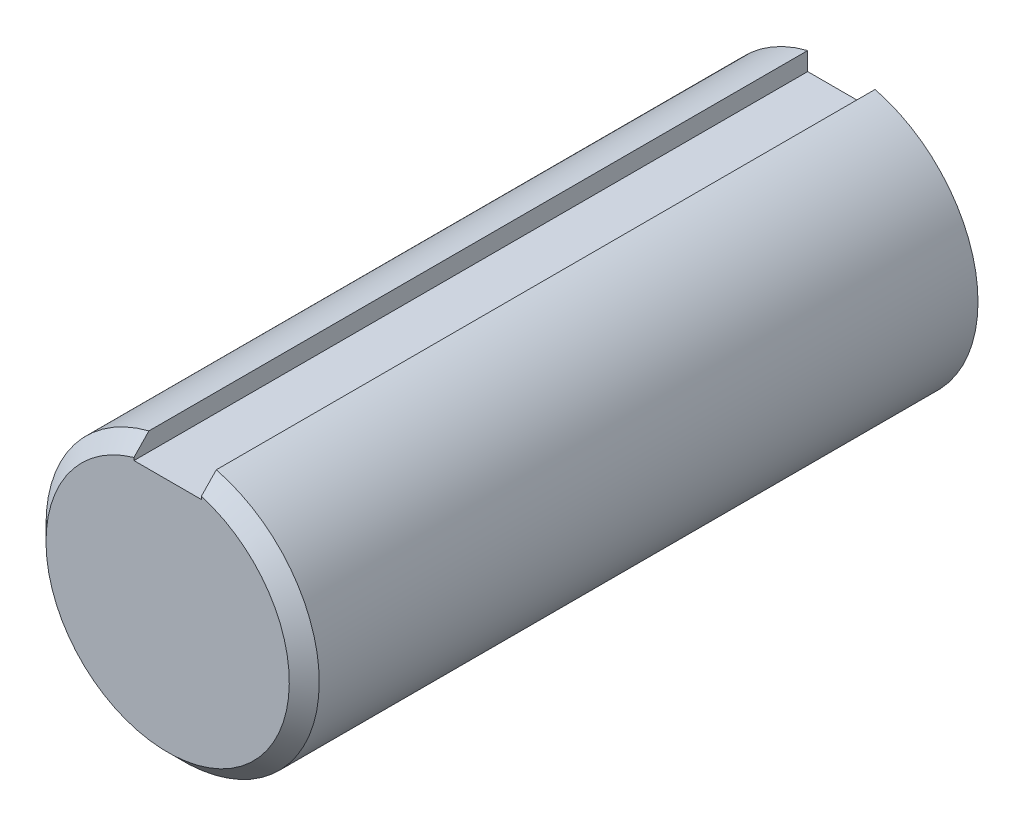
ISO-10303-21;
HEADER;
FILE_DESCRIPTION(('STEP AP214'),'2;1');
FILE_NAME('part.step','',(''),(''),'','','');
FILE_SCHEMA(('AUTOMOTIVE_DESIGN { 1 0 10303 214 1 1 1 1 }'));
ENDSEC;
DATA;
#1=APPLICATION_CONTEXT('core data for automotive mechanical design processes');
#2=APPLICATION_PROTOCOL_DEFINITION('international standard','automotive_design',2000,#1);
#3=PRODUCT_CONTEXT('',#1,'mechanical');
#4=PRODUCT('Part','Part','',(#3));
#5=PRODUCT_RELATED_PRODUCT_CATEGORY('part','',(#4));
#6=PRODUCT_DEFINITION_FORMATION('','',#4);
#7=PRODUCT_DEFINITION_CONTEXT('part definition',#1,'design');
#8=PRODUCT_DEFINITION('design','',#6,#7);
#9=PRODUCT_DEFINITION_SHAPE('','',#8);
#10=(LENGTH_UNIT() NAMED_UNIT(*) SI_UNIT(.MILLI.,.METRE.));
#11=(NAMED_UNIT(*) PLANE_ANGLE_UNIT() SI_UNIT($,.RADIAN.));
#12=(NAMED_UNIT(*) SI_UNIT($,.STERADIAN.) SOLID_ANGLE_UNIT());
#13=UNCERTAINTY_MEASURE_WITH_UNIT(LENGTH_MEASURE(1.E-05),#10,'distance_accuracy_value','');
#14=(GEOMETRIC_REPRESENTATION_CONTEXT(3) GLOBAL_UNCERTAINTY_ASSIGNED_CONTEXT((#13)) GLOBAL_UNIT_ASSIGNED_CONTEXT((#10,
#11,#12)) REPRESENTATION_CONTEXT('',''));
#15=CARTESIAN_POINT('',(0.,0.,0.));
#16=DIRECTION('',(0.,0.,1.));
#17=DIRECTION('',(1.,0.,0.));
#18=AXIS2_PLACEMENT_3D('',#15,#16,#17);
#19=CARTESIAN_POINT('',(0.,0.,90.));
#20=DIRECTION('',(0.,0.,-1.));
#21=DIRECTION('',(-1.,0.,0.));
#22=AXIS2_PLACEMENT_3D('',#19,#20,#21);
#23=CYLINDRICAL_SURFACE('',#22,18.25);
#24=DIRECTION('',(0.,0.,-1.));
#25=VECTOR('',#24,1.);
#26=CARTESIAN_POINT('',(4.5,17.686506155824,90.));
#27=LINE('',#26,#25);
#28=CARTESIAN_POINT('',(4.5,17.686506155824,0.));
#29=VERTEX_POINT('',#28);
#30=CARTESIAN_POINT('',(4.5,17.686506155824,88.));
#31=VERTEX_POINT('',#30);
#32=EDGE_CURVE('E158',#29,#31,#27,.F.);
#33=ORIENTED_EDGE('',*,*,#32,.T.);
#34=CARTESIAN_POINT('',(0.,0.,88.));
#35=DIRECTION('',(0.,0.,1.));
#36=DIRECTION('',(1.,0.,0.));
#37=AXIS2_PLACEMENT_3D('',#34,#35,#36);
#38=CIRCLE('',#37,18.25);
#39=CARTESIAN_POINT('',(-4.5,17.686506155824,88.));
#40=VERTEX_POINT('',#39);
#41=EDGE_CURVE('E61',#31,#40,#38,.F.);
#42=ORIENTED_EDGE('',*,*,#41,.T.);
#43=DIRECTION('',(0.,0.,-1.));
#44=VECTOR('',#43,1.);
#45=CARTESIAN_POINT('',(-4.5,17.686506155824,90.));
#46=LINE('',#45,#44);
#47=CARTESIAN_POINT('',(-4.5,17.686506155824,0.));
#48=VERTEX_POINT('',#47);
#49=EDGE_CURVE('E132',#40,#48,#46,.T.);
#50=ORIENTED_EDGE('',*,*,#49,.T.);
#51=CARTESIAN_POINT('',(0.,0.,0.));
#52=DIRECTION('',(0.,0.,1.));
#53=DIRECTION('',(1.,0.,0.));
#54=AXIS2_PLACEMENT_3D('',#51,#52,#53);
#55=CIRCLE('',#54,18.25);
#56=EDGE_CURVE('E124',#48,#29,#55,.T.);
#57=ORIENTED_EDGE('',*,*,#56,.T.);
#58=EDGE_LOOP('',(#33,#42,#50,#57));
#59=FACE_BOUND('',#58,.T.);
#60=ADVANCED_FACE('F45',(#59),#23,.T.);
#61=CARTESIAN_POINT('',(0.,0.,90.));
#62=DIRECTION('',(0.,0.,1.));
#63=DIRECTION('',(1.,0.,0.));
#64=AXIS2_PLACEMENT_3D('',#61,#62,#63);
#65=PLANE('',#64);
#66=DIRECTION('',(0.,-1.,0.));
#67=VECTOR('',#66,1.);
#68=CARTESIAN_POINT('',(-4.5,21.25,90.));
#69=LINE('',#68,#67);
#70=CARTESIAN_POINT('',(-4.5,15.6144964696272,90.));
#71=VERTEX_POINT('',#70);
#72=CARTESIAN_POINT('',(-4.5,15.25,90.));
#73=VERTEX_POINT('',#72);
#74=EDGE_CURVE('E105',#71,#73,#69,.T.);
#75=ORIENTED_EDGE('',*,*,#74,.F.);
#76=CARTESIAN_POINT('',(0.,0.,90.));
#77=DIRECTION('',(0.,0.,1.));
#78=DIRECTION('',(1.,0.,0.));
#79=AXIS2_PLACEMENT_3D('',#76,#77,#78);
#80=CIRCLE('',#79,16.25);
#81=CARTESIAN_POINT('',(4.5,15.6144964696272,90.));
#82=VERTEX_POINT('',#81);
#83=EDGE_CURVE('E126',#71,#82,#80,.T.);
#84=ORIENTED_EDGE('',*,*,#83,.T.);
#85=DIRECTION('',(0.,1.,0.));
#86=VECTOR('',#85,1.);
#87=CARTESIAN_POINT('',(4.5,21.25,90.));
#88=LINE('',#87,#86);
#89=CARTESIAN_POINT('',(4.5,15.25,90.));
#90=VERTEX_POINT('',#89);
#91=EDGE_CURVE('E120',#90,#82,#88,.T.);
#92=ORIENTED_EDGE('',*,*,#91,.F.);
#93=DIRECTION('',(1.,0.,0.));
#94=VECTOR('',#93,1.);
#95=CARTESIAN_POINT('',(-4.5,15.25,90.));
#96=LINE('',#95,#94);
#97=EDGE_CURVE('E166',#73,#90,#96,.T.);
#98=ORIENTED_EDGE('',*,*,#97,.F.);
#99=EDGE_LOOP('',(#75,#84,#92,#98));
#100=FACE_BOUND('',#99,.T.);
#101=ADVANCED_FACE('F150',(#100),#65,.T.);
#102=CARTESIAN_POINT('',(0.,0.,0.));
#103=DIRECTION('',(0.,0.,1.));
#104=DIRECTION('',(1.,0.,0.));
#105=AXIS2_PLACEMENT_3D('',#102,#103,#104);
#106=PLANE('',#105);
#107=ORIENTED_EDGE('',*,*,#56,.F.);
#108=DIRECTION('',(0.,-1.,0.));
#109=VECTOR('',#108,1.);
#110=CARTESIAN_POINT('',(-4.5,0.,0.));
#111=LINE('',#110,#109);
#112=CARTESIAN_POINT('',(-4.5,15.25,0.));
#113=VERTEX_POINT('',#112);
#114=EDGE_CURVE('E102',#48,#113,#111,.T.);
#115=ORIENTED_EDGE('',*,*,#114,.T.);
#116=DIRECTION('',(1.,0.,0.));
#117=VECTOR('',#116,1.);
#118=CARTESIAN_POINT('',(-4.5,15.25,0.));
#119=LINE('',#118,#117);
#120=CARTESIAN_POINT('',(4.5,15.25,0.));
#121=VERTEX_POINT('',#120);
#122=EDGE_CURVE('E115',#113,#121,#119,.T.);
#123=ORIENTED_EDGE('',*,*,#122,.T.);
#124=DIRECTION('',(0.,1.,0.));
#125=VECTOR('',#124,1.);
#126=CARTESIAN_POINT('',(4.5,21.25,0.));
#127=LINE('',#126,#125);
#128=EDGE_CURVE('E111',#121,#29,#127,.T.);
#129=ORIENTED_EDGE('',*,*,#128,.T.);
#130=EDGE_LOOP('',(#107,#115,#123,#129));
#131=FACE_BOUND('',#130,.T.);
#132=ADVANCED_FACE('F122',(#131),#106,.F.);
#133=CARTESIAN_POINT('',(-4.5,21.25,0.));
#134=DIRECTION('',(-1.,0.,0.));
#135=DIRECTION('',(0.,-1.,0.));
#136=AXIS2_PLACEMENT_3D('',#133,#134,#135);
#137=PLANE('',#136);
#138=ORIENTED_EDGE('',*,*,#49,.F.);
#139=CARTESIAN_POINT('',(-4.5,17.686506155824,88.));
#140=CARTESIAN_POINT('',(-4.5,17.5141724349954,88.1670121494405));
#141=CARTESIAN_POINT('',(-4.5,17.3417650584135,88.3339483247503));
#142=CARTESIAN_POINT('',(-4.5,16.9967888327292,88.6676533545538));
#143=CARTESIAN_POINT('',(-4.5,16.8242199838093,88.834422209236));
#144=CARTESIAN_POINT('',(-4.5,16.4789062321806,89.1677776325199));
#145=CARTESIAN_POINT('',(-4.5,16.3061613294401,89.3343642010884));
#146=CARTESIAN_POINT('',(-4.5,15.9604781603139,89.6673369770075));
#147=CARTESIAN_POINT('',(-4.5,15.7875398937101,89.8337231841316));
#148=CARTESIAN_POINT('',(-4.5,15.6144964696272,90.));
#149=B_SPLINE_CURVE_WITH_KNOTS('',3,(#139,#140,#141,#142,#143,#144,#145,#146,#147,#148),
.UNSPECIFIED.,.F.,.F.,(4,2,2,2,4),(0.,0.719949812092074,1.43989881164123,2.15984794180479,
2.87979788483486),.UNSPECIFIED.);
#150=EDGE_CURVE('E11',#40,#71,#149,.T.);
#151=ORIENTED_EDGE('',*,*,#150,.T.);
#152=ORIENTED_EDGE('',*,*,#74,.T.);
#153=DIRECTION('',(0.,0.,1.));
#154=VECTOR('',#153,1.);
#155=CARTESIAN_POINT('',(-4.5,15.25,0.));
#156=LINE('',#155,#154);
#157=EDGE_CURVE('E98',#113,#73,#156,.T.);
#158=ORIENTED_EDGE('',*,*,#157,.F.);
#159=ORIENTED_EDGE('',*,*,#114,.F.);
#160=EDGE_LOOP('',(#138,#151,#152,#158,#159));
#161=FACE_BOUND('',#160,.T.);
#162=ADVANCED_FACE('F100',(#161),#137,.F.);
#163=CARTESIAN_POINT('',(4.5,21.25,0.));
#164=DIRECTION('',(1.,0.,0.));
#165=DIRECTION('',(0.,1.,0.));
#166=AXIS2_PLACEMENT_3D('',#163,#164,#165);
#167=PLANE('',#166);
#168=ORIENTED_EDGE('',*,*,#91,.T.);
#169=CARTESIAN_POINT('',(4.5,15.6144964696272,90.));
#170=CARTESIAN_POINT('',(4.5,15.7875398937101,89.8337231841316));
#171=CARTESIAN_POINT('',(4.5,15.9604781603139,89.6673369770075));
#172=CARTESIAN_POINT('',(4.5,16.3061613294401,89.3343642010884));
#173=CARTESIAN_POINT('',(4.5,16.4789062321806,89.1677776325198));
#174=CARTESIAN_POINT('',(4.5,16.8242199838093,88.834422209236));
#175=CARTESIAN_POINT('',(4.5,16.9967888327292,88.6676533545538));
#176=CARTESIAN_POINT('',(4.5,17.3417650584135,88.3339483247503));
#177=CARTESIAN_POINT('',(4.5,17.5141724349954,88.1670121494405));
#178=CARTESIAN_POINT('',(4.5,17.686506155824,88.));
#179=B_SPLINE_CURVE_WITH_KNOTS('',3,(#169,#170,#171,#172,#173,#174,#175,#176,#177,#178),
.UNSPECIFIED.,.F.,.F.,(4,2,2,2,4),(0.,0.719949943030087,1.43989907319363,2.15984807274279,
2.87979788483486),.UNSPECIFIED.);
#180=EDGE_CURVE('E75',#82,#31,#179,.T.);
#181=ORIENTED_EDGE('',*,*,#180,.T.);
#182=ORIENTED_EDGE('',*,*,#32,.F.);
#183=ORIENTED_EDGE('',*,*,#128,.F.);
#184=DIRECTION('',(0.,0.,1.));
#185=VECTOR('',#184,1.);
#186=CARTESIAN_POINT('',(4.5,15.25,0.));
#187=LINE('',#186,#185);
#188=EDGE_CURVE('E110',#121,#90,#187,.T.);
#189=ORIENTED_EDGE('',*,*,#188,.T.);
#190=EDGE_LOOP('',(#168,#181,#182,#183,#189));
#191=FACE_BOUND('',#190,.T.);
#192=ADVANCED_FACE('F142',(#191),#167,.F.);
#193=CARTESIAN_POINT('',(-4.5,15.25,0.));
#194=DIRECTION('',(0.,-1.,0.));
#195=DIRECTION('',(0.,0.,-1.));
#196=AXIS2_PLACEMENT_3D('',#193,#194,#195);
#197=PLANE('',#196);
#198=ORIENTED_EDGE('',*,*,#97,.T.);
#199=ORIENTED_EDGE('',*,*,#188,.F.);
#200=ORIENTED_EDGE('',*,*,#122,.F.);
#201=ORIENTED_EDGE('',*,*,#157,.T.);
#202=EDGE_LOOP('',(#198,#199,#200,#201));
#203=FACE_BOUND('',#202,.T.);
#204=ADVANCED_FACE('F116',(#203),#197,.F.);
#205=CARTESIAN_POINT('',(0.,0.,90.));
#206=DIRECTION('',(0.,0.,-1.));
#207=DIRECTION('',(-1.,0.,0.));
#208=AXIS2_PLACEMENT_3D('',#205,#206,#207);
#209=CONICAL_SURFACE('',#208,16.25,0.785398163397445);
#210=ORIENTED_EDGE('',*,*,#150,.F.);
#211=ORIENTED_EDGE('',*,*,#41,.F.);
#212=ORIENTED_EDGE('',*,*,#180,.F.);
#213=ORIENTED_EDGE('',*,*,#83,.F.);
#214=EDGE_LOOP('',(#210,#211,#212,#213));
#215=FACE_BOUND('',#214,.T.);
#216=ADVANCED_FACE('F48',(#215),#209,.T.);
#217=CLOSED_SHELL('',(#60,#101,#132,#162,#192,#204,#216));
#218=MANIFOLD_SOLID_BREP('B2',#217);
#219=ADVANCED_BREP_SHAPE_REPRESENTATION('',(#18,#218),#14);
#220=SHAPE_DEFINITION_REPRESENTATION(#9,#219);
ENDSEC;
END-ISO-10303-21;
